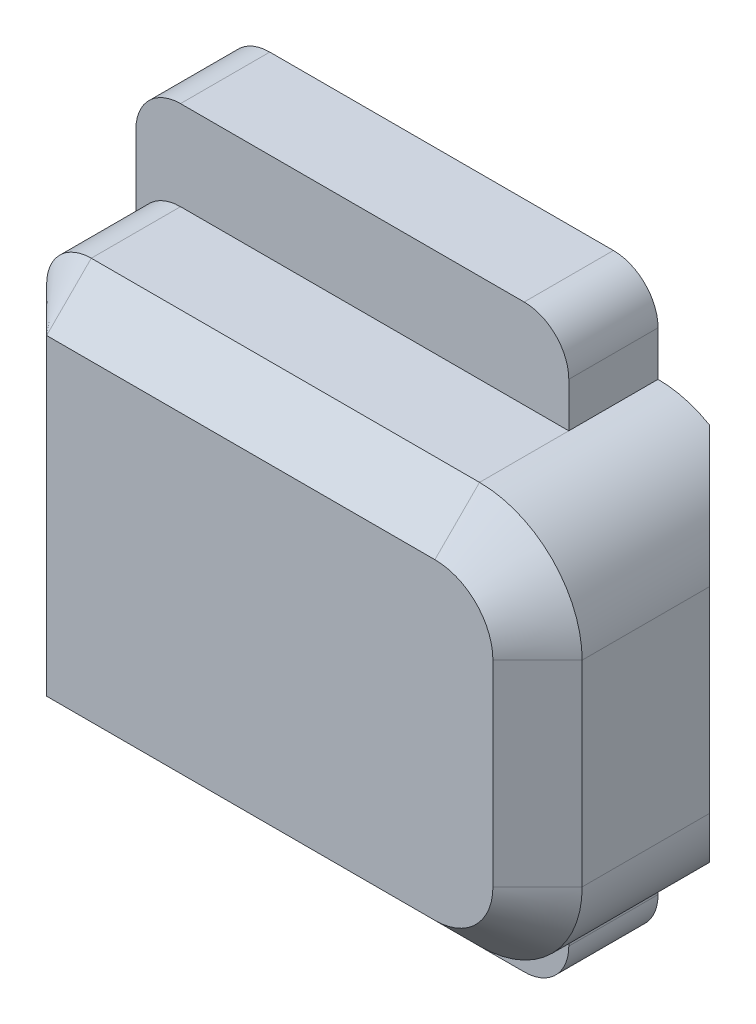
ISO-10303-21;
HEADER;
FILE_DESCRIPTION(('STEP AP214'),'2;1');
FILE_NAME('part.step','',(''),(''),'','','');
FILE_SCHEMA(('AUTOMOTIVE_DESIGN { 1 0 10303 214 1 1 1 1 }'));
ENDSEC;
DATA;
#1=APPLICATION_CONTEXT('core data for automotive mechanical design processes');
#2=APPLICATION_PROTOCOL_DEFINITION('international standard','automotive_design',2000,#1);
#3=PRODUCT_CONTEXT('',#1,'mechanical');
#4=PRODUCT('Part','Part','',(#3));
#5=PRODUCT_RELATED_PRODUCT_CATEGORY('part','',(#4));
#6=PRODUCT_DEFINITION_FORMATION('','',#4);
#7=PRODUCT_DEFINITION_CONTEXT('part definition',#1,'design');
#8=PRODUCT_DEFINITION('design','',#6,#7);
#9=PRODUCT_DEFINITION_SHAPE('','',#8);
#10=(LENGTH_UNIT() NAMED_UNIT(*) SI_UNIT(.MILLI.,.METRE.));
#11=(NAMED_UNIT(*) PLANE_ANGLE_UNIT() SI_UNIT($,.RADIAN.));
#12=(NAMED_UNIT(*) SI_UNIT($,.STERADIAN.) SOLID_ANGLE_UNIT());
#13=UNCERTAINTY_MEASURE_WITH_UNIT(LENGTH_MEASURE(1.E-05),#10,'distance_accuracy_value','');
#14=(GEOMETRIC_REPRESENTATION_CONTEXT(3) GLOBAL_UNCERTAINTY_ASSIGNED_CONTEXT((#13)) GLOBAL_UNIT_ASSIGNED_CONTEXT((#10,
#11,#12)) REPRESENTATION_CONTEXT('',''));
#15=CARTESIAN_POINT('',(0.,0.,0.));
#16=DIRECTION('',(0.,0.,1.));
#17=DIRECTION('',(1.,0.,0.));
#18=AXIS2_PLACEMENT_3D('',#15,#16,#17);
#19=CARTESIAN_POINT('',(7.9,-0.100000000000001,-2.5));
#20=DIRECTION('',(0.,1.,0.));
#21=DIRECTION('',(-1.,0.,0.));
#22=AXIS2_PLACEMENT_3D('',#19,#20,#21);
#23=PLANE('',#22);
#24=DIRECTION('',(0.,0.,-1.));
#25=VECTOR('',#24,1.);
#26=CARTESIAN_POINT('',(3.55,-0.100000000000001,0.));
#27=LINE('',#26,#25);
#28=CARTESIAN_POINT('',(3.55,-0.100000000000001,-1.5));
#29=VERTEX_POINT('',#28);
#30=CARTESIAN_POINT('',(3.55,-0.100000000000001,-0.500000000000003));
#31=VERTEX_POINT('',#30);
#32=EDGE_CURVE('E253',#29,#31,#27,.F.);
#33=ORIENTED_EDGE('',*,*,#32,.T.);
#34=DIRECTION('',(1.,0.,0.));
#35=VECTOR('',#34,1.);
#36=CARTESIAN_POINT('',(7.9,-0.100000000000001,-0.500000000000003));
#37=LINE('',#36,#35);
#38=CARTESIAN_POINT('',(7.9,-0.100000000000002,-0.500000000000003));
#39=VERTEX_POINT('',#38);
#40=EDGE_CURVE('E45',#31,#39,#37,.T.);
#41=ORIENTED_EDGE('',*,*,#40,.T.);
#42=DIRECTION('',(0.,0.,1.));
#43=VECTOR('',#42,1.);
#44=CARTESIAN_POINT('',(7.9,-0.100000000000002,-2.5));
#45=LINE('',#44,#43);
#46=CARTESIAN_POINT('',(7.9,-0.100000000000002,-1.5));
#47=VERTEX_POINT('',#46);
#48=EDGE_CURVE('E219',#47,#39,#45,.T.);
#49=ORIENTED_EDGE('',*,*,#48,.F.);
#50=DIRECTION('',(-1.,0.,0.));
#51=VECTOR('',#50,1.);
#52=CARTESIAN_POINT('',(7.9,-0.100000000000001,-1.5));
#53=LINE('',#52,#51);
#54=EDGE_CURVE('E212',#47,#29,#53,.T.);
#55=ORIENTED_EDGE('',*,*,#54,.T.);
#56=EDGE_LOOP('',(#33,#41,#49,#55));
#57=FACE_BOUND('',#56,.T.);
#58=ADVANCED_FACE('F36',(#57),#23,.T.);
#59=CARTESIAN_POINT('',(-7.9,-4.6,-2.5));
#60=DIRECTION('',(0.,-1.,0.));
#61=DIRECTION('',(0.,0.,-1.));
#62=AXIS2_PLACEMENT_3D('',#59,#60,#61);
#63=PLANE('',#62);
#64=DIRECTION('',(0.,0.,1.));
#65=VECTOR('',#64,1.);
#66=CARTESIAN_POINT('',(7.89999999999999,-4.6,-2.5));
#67=LINE('',#66,#65);
#68=CARTESIAN_POINT('',(7.9,-4.6,-1.5));
#69=VERTEX_POINT('',#68);
#70=CARTESIAN_POINT('',(7.89999999999999,-4.6,-0.500000000000003));
#71=VERTEX_POINT('',#70);
#72=EDGE_CURVE('E206',#69,#71,#67,.T.);
#73=ORIENTED_EDGE('',*,*,#72,.T.);
#74=DIRECTION('',(-1.,0.,0.));
#75=VECTOR('',#74,1.);
#76=CARTESIAN_POINT('',(-7.9,-4.6,-0.500000000000003));
#77=LINE('',#76,#75);
#78=CARTESIAN_POINT('',(3.55,-4.6,-0.500000000000003));
#79=VERTEX_POINT('',#78);
#80=EDGE_CURVE('E289',#71,#79,#77,.T.);
#81=ORIENTED_EDGE('',*,*,#80,.T.);
#82=DIRECTION('',(0.,0.,1.));
#83=VECTOR('',#82,1.);
#84=CARTESIAN_POINT('',(3.55,-4.6,-1.5));
#85=LINE('',#84,#83);
#86=CARTESIAN_POINT('',(3.55,-4.6,-1.5));
#87=VERTEX_POINT('',#86);
#88=EDGE_CURVE('E251',#79,#87,#85,.F.);
#89=ORIENTED_EDGE('',*,*,#88,.T.);
#90=DIRECTION('',(1.,0.,0.));
#91=VECTOR('',#90,1.);
#92=CARTESIAN_POINT('',(-7.9,-4.6,-1.5));
#93=LINE('',#92,#91);
#94=EDGE_CURVE('E349',#87,#69,#93,.T.);
#95=ORIENTED_EDGE('',*,*,#94,.T.);
#96=EDGE_LOOP('',(#73,#81,#89,#95));
#97=FACE_BOUND('',#96,.T.);
#98=ADVANCED_FACE('F395',(#97),#63,.T.);
#99=CARTESIAN_POINT('',(7.9,-1.25,-2.5));
#100=DIRECTION('',(0.,0.,1.));
#101=DIRECTION('',(1.,0.,0.));
#102=AXIS2_PLACEMENT_3D('',#99,#100,#101);
#103=CYLINDRICAL_SURFACE('',#102,1.15);
#104=ORIENTED_EDGE('',*,*,#48,.T.);
#105=CARTESIAN_POINT('',(7.9,-1.25,-0.500000000000003));
#106=DIRECTION('',(0.,0.,1.));
#107=DIRECTION('',(1.,0.,0.));
#108=AXIS2_PLACEMENT_3D('',#105,#106,#107);
#109=CIRCLE('',#108,1.15);
#110=CARTESIAN_POINT('',(9.05,-1.25,-0.500000000000003));
#111=VERTEX_POINT('',#110);
#112=EDGE_CURVE('E11',#39,#111,#109,.F.);
#113=ORIENTED_EDGE('',*,*,#112,.T.);
#114=DIRECTION('',(0.,0.,1.));
#115=VECTOR('',#114,1.);
#116=CARTESIAN_POINT('',(9.05,-1.25,-2.5));
#117=LINE('',#116,#115);
#118=CARTESIAN_POINT('',(9.05,-1.25,-1.92500000000001));
#119=VERTEX_POINT('',#118);
#120=EDGE_CURVE('E198',#119,#111,#117,.T.);
#121=ORIENTED_EDGE('',*,*,#120,.F.);
#122=CARTESIAN_POINT('',(7.9,-1.25,-3.07499999999999));
#123=DIRECTION('',(-0.707106781186543,0.,0.707106781186552));
#124=DIRECTION('',(0.707106781186552,0.,0.707106781186543));
#125=AXIS2_PLACEMENT_3D('',#122,#123,#124);
#126=ELLIPSE('',#125,1.62634559672905,1.15);
#127=CARTESIAN_POINT('',(8.475,-0.254070785647898,-2.5));
#128=VERTEX_POINT('',#127);
#129=EDGE_CURVE('E183',#128,#119,#126,.F.);
#130=ORIENTED_EDGE('',*,*,#129,.F.);
#131=CARTESIAN_POINT('',(7.9,-1.25,-2.5));
#132=DIRECTION('',(0.,0.,1.));
#133=DIRECTION('',(1.,0.,0.));
#134=AXIS2_PLACEMENT_3D('',#131,#132,#133);
#135=CIRCLE('',#134,1.15);
#136=CARTESIAN_POINT('',(7.9,-0.0999999999999977,-2.5));
#137=VERTEX_POINT('',#136);
#138=EDGE_CURVE('E196',#128,#137,#135,.T.);
#139=ORIENTED_EDGE('',*,*,#138,.T.);
#140=EDGE_CURVE('E216',#137,#47,#45,.T.);
#141=ORIENTED_EDGE('',*,*,#140,.T.);
#142=EDGE_LOOP('',(#104,#113,#121,#130,#139,#141));
#143=FACE_BOUND('',#142,.T.);
#144=ADVANCED_FACE('F194',(#143),#103,.T.);
#145=CARTESIAN_POINT('',(9.05,-3.45,-2.5));
#146=DIRECTION('',(1.,0.,0.));
#147=DIRECTION('',(0.,0.,-1.));
#148=AXIS2_PLACEMENT_3D('',#145,#146,#147);
#149=PLANE('',#148);
#150=ORIENTED_EDGE('',*,*,#120,.T.);
#151=DIRECTION('',(0.,-1.,0.));
#152=VECTOR('',#151,1.);
#153=CARTESIAN_POINT('',(9.05,-3.45,-0.500000000000003));
#154=LINE('',#153,#152);
#155=CARTESIAN_POINT('',(9.05,-3.45,-0.500000000000003));
#156=VERTEX_POINT('',#155);
#157=EDGE_CURVE('E297',#111,#156,#154,.T.);
#158=ORIENTED_EDGE('',*,*,#157,.T.);
#159=DIRECTION('',(0.,0.,1.));
#160=VECTOR('',#159,1.);
#161=CARTESIAN_POINT('',(9.05,-3.45,-2.5));
#162=LINE('',#161,#160);
#163=CARTESIAN_POINT('',(9.05,-3.45,-1.92500000000001));
#164=VERTEX_POINT('',#163);
#165=EDGE_CURVE('E221',#164,#156,#162,.T.);
#166=ORIENTED_EDGE('',*,*,#165,.F.);
#167=DIRECTION('',(0.,1.,0.));
#168=VECTOR('',#167,1.);
#169=CARTESIAN_POINT('',(9.05,-5.6,-1.92500000000001));
#170=LINE('',#169,#168);
#171=EDGE_CURVE('E337',#164,#119,#170,.T.);
#172=ORIENTED_EDGE('',*,*,#171,.T.);
#173=EDGE_LOOP('',(#150,#158,#166,#172));
#174=FACE_BOUND('',#173,.T.);
#175=ADVANCED_FACE('F414',(#174),#149,.T.);
#176=CARTESIAN_POINT('',(7.9,-3.45,-2.5));
#177=DIRECTION('',(0.,0.,1.));
#178=DIRECTION('',(1.,0.,0.));
#179=AXIS2_PLACEMENT_3D('',#176,#177,#178);
#180=CYLINDRICAL_SURFACE('',#179,1.15);
#181=ORIENTED_EDGE('',*,*,#165,.T.);
#182=CARTESIAN_POINT('',(7.9,-3.45,-0.500000000000003));
#183=DIRECTION('',(0.,0.,1.));
#184=DIRECTION('',(1.,0.,0.));
#185=AXIS2_PLACEMENT_3D('',#182,#183,#184);
#186=CIRCLE('',#185,1.15);
#187=EDGE_CURVE('E293',#156,#71,#186,.F.);
#188=ORIENTED_EDGE('',*,*,#187,.T.);
#189=ORIENTED_EDGE('',*,*,#72,.F.);
#190=CARTESIAN_POINT('',(7.9,-4.6,-2.5));
#191=VERTEX_POINT('',#190);
#192=EDGE_CURVE('E210',#191,#69,#67,.T.);
#193=ORIENTED_EDGE('',*,*,#192,.F.);
#194=CARTESIAN_POINT('',(7.9,-3.45,-2.5));
#195=DIRECTION('',(0.,0.,1.));
#196=DIRECTION('',(-1.,0.,0.));
#197=AXIS2_PLACEMENT_3D('',#194,#195,#196);
#198=CIRCLE('',#197,1.15);
#199=CARTESIAN_POINT('',(8.475,-4.44592921435211,-2.5));
#200=VERTEX_POINT('',#199);
#201=EDGE_CURVE('E207',#191,#200,#198,.T.);
#202=ORIENTED_EDGE('',*,*,#201,.T.);
#203=CARTESIAN_POINT('',(7.9,-3.45,-3.07499999999999));
#204=DIRECTION('',(-0.707106781186543,0.,0.707106781186552));
#205=DIRECTION('',(0.707106781186552,0.,0.707106781186543));
#206=AXIS2_PLACEMENT_3D('',#203,#204,#205);
#207=ELLIPSE('',#206,1.62634559672905,1.15);
#208=EDGE_CURVE('E186',#164,#200,#207,.F.);
#209=ORIENTED_EDGE('',*,*,#208,.F.);
#210=EDGE_LOOP('',(#181,#188,#189,#193,#202,#209));
#211=FACE_BOUND('',#210,.T.);
#212=ADVANCED_FACE('F391',(#211),#180,.T.);
#213=CARTESIAN_POINT('',(-7.9,-1.25,-2.5));
#214=DIRECTION('',(0.,0.,1.));
#215=DIRECTION('',(1.,0.,0.));
#216=AXIS2_PLACEMENT_3D('',#213,#214,#215);
#217=PLANE('',#216);
#218=DIRECTION('',(0.,-1.,0.));
#219=VECTOR('',#218,1.);
#220=CARTESIAN_POINT('',(3.05,0.899999999999999,-2.5));
#221=LINE('',#220,#219);
#222=CARTESIAN_POINT('',(3.05,0.399999999999998,-2.5));
#223=VERTEX_POINT('',#222);
#224=CARTESIAN_POINT('',(3.05,-5.1,-2.5));
#225=VERTEX_POINT('',#224);
#226=EDGE_CURVE('E322',#223,#225,#221,.T.);
#227=ORIENTED_EDGE('',*,*,#226,.F.);
#228=CARTESIAN_POINT('',(3.55,0.399999999999998,-2.5));
#229=DIRECTION('',(0.,0.,1.));
#230=DIRECTION('',(1.,0.,0.));
#231=AXIS2_PLACEMENT_3D('',#228,#229,#230);
#232=CIRCLE('',#231,0.5);
#233=CARTESIAN_POINT('',(3.55,0.899999999999998,-2.5));
#234=VERTEX_POINT('',#233);
#235=EDGE_CURVE('E257',#223,#234,#232,.F.);
#236=ORIENTED_EDGE('',*,*,#235,.T.);
#237=DIRECTION('',(1.,0.,0.));
#238=VECTOR('',#237,1.);
#239=CARTESIAN_POINT('',(7.9,0.899999999999998,-2.5));
#240=LINE('',#239,#238);
#241=CARTESIAN_POINT('',(7.4,0.899999999999998,-2.5));
#242=VERTEX_POINT('',#241);
#243=EDGE_CURVE('E199',#234,#242,#240,.T.);
#244=ORIENTED_EDGE('',*,*,#243,.T.);
#245=CARTESIAN_POINT('',(7.4,0.399999999999998,-2.5));
#246=DIRECTION('',(0.,0.,1.));
#247=DIRECTION('',(1.,0.,0.));
#248=AXIS2_PLACEMENT_3D('',#245,#246,#247);
#249=CIRCLE('',#248,0.5);
#250=CARTESIAN_POINT('',(7.9,0.399999999999998,-2.5));
#251=VERTEX_POINT('',#250);
#252=EDGE_CURVE('E226',#242,#251,#249,.F.);
#253=ORIENTED_EDGE('',*,*,#252,.T.);
#254=DIRECTION('',(0.,-1.,0.));
#255=VECTOR('',#254,1.);
#256=CARTESIAN_POINT('',(7.9,0.899999999999998,-2.5));
#257=LINE('',#256,#255);
#258=EDGE_CURVE('E204',#251,#137,#257,.T.);
#259=ORIENTED_EDGE('',*,*,#258,.T.);
#260=ORIENTED_EDGE('',*,*,#138,.F.);
#261=DIRECTION('',(0.,-1.,0.));
#262=VECTOR('',#261,1.);
#263=CARTESIAN_POINT('',(8.475,-1.25,-2.5));
#264=LINE('',#263,#262);
#265=EDGE_CURVE('E180',#128,#200,#264,.T.);
#266=ORIENTED_EDGE('',*,*,#265,.T.);
#267=ORIENTED_EDGE('',*,*,#201,.F.);
#268=CARTESIAN_POINT('',(7.9,-5.1,-2.5));
#269=VERTEX_POINT('',#268);
#270=EDGE_CURVE('E351',#191,#269,#257,.T.);
#271=ORIENTED_EDGE('',*,*,#270,.T.);
#272=CARTESIAN_POINT('',(7.4,-5.1,-2.5));
#273=DIRECTION('',(0.,0.,1.));
#274=DIRECTION('',(1.,0.,0.));
#275=AXIS2_PLACEMENT_3D('',#272,#273,#274);
#276=CIRCLE('',#275,0.5);
#277=CARTESIAN_POINT('',(7.4,-5.6,-2.5));
#278=VERTEX_POINT('',#277);
#279=EDGE_CURVE('E218',#269,#278,#276,.F.);
#280=ORIENTED_EDGE('',*,*,#279,.T.);
#281=DIRECTION('',(-1.,0.,0.));
#282=VECTOR('',#281,1.);
#283=CARTESIAN_POINT('',(7.9,-5.6,-2.5));
#284=LINE('',#283,#282);
#285=CARTESIAN_POINT('',(3.55,-5.6,-2.5));
#286=VERTEX_POINT('',#285);
#287=EDGE_CURVE('E343',#278,#286,#284,.T.);
#288=ORIENTED_EDGE('',*,*,#287,.T.);
#289=CARTESIAN_POINT('',(3.55,-5.1,-2.5));
#290=DIRECTION('',(0.,0.,1.));
#291=DIRECTION('',(1.,0.,0.));
#292=AXIS2_PLACEMENT_3D('',#289,#290,#291);
#293=CIRCLE('',#292,0.5);
#294=EDGE_CURVE('E255',#286,#225,#293,.F.);
#295=ORIENTED_EDGE('',*,*,#294,.T.);
#296=EDGE_LOOP('',(#227,#236,#244,#253,#259,#260,#266,#267,#271,#280,#288,#295));
#297=FACE_BOUND('',#296,.T.);
#298=ADVANCED_FACE('F202',(#297),#217,.F.);
#299=CARTESIAN_POINT('',(-7.9,-1.25,0.));
#300=DIRECTION('',(0.,0.,1.));
#301=DIRECTION('',(1.,0.,0.));
#302=AXIS2_PLACEMENT_3D('',#299,#300,#301);
#303=PLANE('',#302);
#304=DIRECTION('',(0.,-1.,0.));
#305=VECTOR('',#304,1.);
#306=CARTESIAN_POINT('',(3.55,-4.1,0.));
#307=LINE('',#306,#305);
#308=CARTESIAN_POINT('',(3.55,-0.600000000000002,0.));
#309=VERTEX_POINT('',#308);
#310=CARTESIAN_POINT('',(3.55,-4.1,0.));
#311=VERTEX_POINT('',#310);
#312=EDGE_CURVE('E284',#309,#311,#307,.T.);
#313=ORIENTED_EDGE('',*,*,#312,.T.);
#314=DIRECTION('',(1.,0.,0.));
#315=VECTOR('',#314,1.);
#316=CARTESIAN_POINT('',(-7.9,-4.1,0.));
#317=LINE('',#316,#315);
#318=CARTESIAN_POINT('',(7.89999999999999,-4.1,0.));
#319=VERTEX_POINT('',#318);
#320=EDGE_CURVE('E286',#311,#319,#317,.T.);
#321=ORIENTED_EDGE('',*,*,#320,.T.);
#322=CARTESIAN_POINT('',(7.9,-3.45,0.));
#323=DIRECTION('',(0.,0.,1.));
#324=DIRECTION('',(1.,0.,0.));
#325=AXIS2_PLACEMENT_3D('',#322,#323,#324);
#326=CIRCLE('',#325,0.649999999999998);
#327=CARTESIAN_POINT('',(8.55,-3.45,0.));
#328=VERTEX_POINT('',#327);
#329=EDGE_CURVE('E282',#319,#328,#326,.T.);
#330=ORIENTED_EDGE('',*,*,#329,.T.);
#331=DIRECTION('',(0.,1.,0.));
#332=VECTOR('',#331,1.);
#333=CARTESIAN_POINT('',(8.55,-1.25,0.));
#334=LINE('',#333,#332);
#335=CARTESIAN_POINT('',(8.55,-1.25,0.));
#336=VERTEX_POINT('',#335);
#337=EDGE_CURVE('E280',#328,#336,#334,.T.);
#338=ORIENTED_EDGE('',*,*,#337,.T.);
#339=CARTESIAN_POINT('',(7.9,-1.25,0.));
#340=DIRECTION('',(0.,0.,1.));
#341=DIRECTION('',(1.,0.,0.));
#342=AXIS2_PLACEMENT_3D('',#339,#340,#341);
#343=CIRCLE('',#342,0.649999999999998);
#344=CARTESIAN_POINT('',(7.9,-0.600000000000003,0.));
#345=VERTEX_POINT('',#344);
#346=EDGE_CURVE('E276',#336,#345,#343,.T.);
#347=ORIENTED_EDGE('',*,*,#346,.T.);
#348=DIRECTION('',(-1.,0.,0.));
#349=VECTOR('',#348,1.);
#350=CARTESIAN_POINT('',(-7.9,-0.600000000000002,0.));
#351=LINE('',#350,#349);
#352=EDGE_CURVE('E278',#345,#309,#351,.T.);
#353=ORIENTED_EDGE('',*,*,#352,.T.);
#354=EDGE_LOOP('',(#313,#321,#330,#338,#347,#353));
#355=FACE_BOUND('',#354,.T.);
#356=ADVANCED_FACE('F376',(#355),#303,.T.);
#357=CARTESIAN_POINT('',(7.9,-5.6,-1.5));
#358=DIRECTION('',(0.,-1.,0.));
#359=DIRECTION('',(0.,0.,-1.));
#360=AXIS2_PLACEMENT_3D('',#357,#358,#359);
#361=PLANE('',#360);
#362=DIRECTION('',(-1.,0.,0.));
#363=VECTOR('',#362,1.);
#364=CARTESIAN_POINT('',(7.9,-5.6,-1.5));
#365=LINE('',#364,#363);
#366=CARTESIAN_POINT('',(7.4,-5.6,-1.5));
#367=VERTEX_POINT('',#366);
#368=CARTESIAN_POINT('',(3.55,-5.6,-1.5));
#369=VERTEX_POINT('',#368);
#370=EDGE_CURVE('E346',#367,#369,#365,.T.);
#371=ORIENTED_EDGE('',*,*,#370,.T.);
#372=DIRECTION('',(0.,0.,-1.));
#373=VECTOR('',#372,1.);
#374=CARTESIAN_POINT('',(3.55,-5.6,-2.5));
#375=LINE('',#374,#373);
#376=EDGE_CURVE('E263',#369,#286,#375,.T.);
#377=ORIENTED_EDGE('',*,*,#376,.T.);
#378=ORIENTED_EDGE('',*,*,#287,.F.);
#379=DIRECTION('',(0.,0.,-1.));
#380=VECTOR('',#379,1.);
#381=CARTESIAN_POINT('',(7.4,-5.6,-1.5));
#382=LINE('',#381,#380);
#383=EDGE_CURVE('E236',#278,#367,#382,.F.);
#384=ORIENTED_EDGE('',*,*,#383,.T.);
#385=EDGE_LOOP('',(#371,#377,#378,#384));
#386=FACE_BOUND('',#385,.T.);
#387=ADVANCED_FACE('F599',(#386),#361,.T.);
#388=CARTESIAN_POINT('',(0.,0.,-1.5));
#389=DIRECTION('',(0.,0.,-1.));
#390=DIRECTION('',(-1.,0.,0.));
#391=AXIS2_PLACEMENT_3D('',#388,#389,#390);
#392=PLANE('',#391);
#393=DIRECTION('',(0.,-1.,0.));
#394=VECTOR('',#393,1.);
#395=CARTESIAN_POINT('',(3.05,0.,-1.5));
#396=LINE('',#395,#394);
#397=CARTESIAN_POINT('',(3.05,-4.1,-1.5));
#398=VERTEX_POINT('',#397);
#399=CARTESIAN_POINT('',(3.05,-5.1,-1.5));
#400=VERTEX_POINT('',#399);
#401=EDGE_CURVE('E332',#398,#400,#396,.T.);
#402=ORIENTED_EDGE('',*,*,#401,.T.);
#403=CARTESIAN_POINT('',(3.55,-5.1,-1.5));
#404=DIRECTION('',(0.,0.,-1.));
#405=DIRECTION('',(-1.,0.,0.));
#406=AXIS2_PLACEMENT_3D('',#403,#404,#405);
#407=CIRCLE('',#406,0.5);
#408=EDGE_CURVE('E266',#400,#369,#407,.F.);
#409=ORIENTED_EDGE('',*,*,#408,.T.);
#410=ORIENTED_EDGE('',*,*,#370,.F.);
#411=CARTESIAN_POINT('',(7.4,-5.1,-1.5));
#412=DIRECTION('',(0.,0.,-1.));
#413=DIRECTION('',(-1.,0.,0.));
#414=AXIS2_PLACEMENT_3D('',#411,#412,#413);
#415=CIRCLE('',#414,0.5);
#416=CARTESIAN_POINT('',(7.9,-5.1,-1.5));
#417=VERTEX_POINT('',#416);
#418=EDGE_CURVE('E238',#367,#417,#415,.F.);
#419=ORIENTED_EDGE('',*,*,#418,.T.);
#420=DIRECTION('',(0.,-1.,0.));
#421=VECTOR('',#420,1.);
#422=CARTESIAN_POINT('',(7.9,0.899999999999998,-1.5));
#423=LINE('',#422,#421);
#424=EDGE_CURVE('E342',#69,#417,#423,.T.);
#425=ORIENTED_EDGE('',*,*,#424,.F.);
#426=ORIENTED_EDGE('',*,*,#94,.F.);
#427=CARTESIAN_POINT('',(3.55,-4.1,-1.5));
#428=DIRECTION('',(0.,0.,-1.));
#429=DIRECTION('',(-1.,0.,0.));
#430=AXIS2_PLACEMENT_3D('',#427,#428,#429);
#431=CIRCLE('',#430,0.5);
#432=EDGE_CURVE('E268',#87,#398,#431,.T.);
#433=ORIENTED_EDGE('',*,*,#432,.T.);
#434=EDGE_LOOP('',(#402,#409,#410,#419,#425,#426,#433));
#435=FACE_BOUND('',#434,.T.);
#436=ADVANCED_FACE('F406',(#435),#392,.F.);
#437=CARTESIAN_POINT('',(7.9,0.899999999999998,-1.5));
#438=DIRECTION('',(1.,0.,0.));
#439=DIRECTION('',(0.,0.,-1.));
#440=AXIS2_PLACEMENT_3D('',#437,#438,#439);
#441=PLANE('',#440);
#442=ORIENTED_EDGE('',*,*,#424,.T.);
#443=DIRECTION('',(0.,0.,-1.));
#444=VECTOR('',#443,1.);
#445=CARTESIAN_POINT('',(7.9,-5.1,-1.5));
#446=LINE('',#445,#444);
#447=EDGE_CURVE('E192',#417,#269,#446,.T.);
#448=ORIENTED_EDGE('',*,*,#447,.T.);
#449=ORIENTED_EDGE('',*,*,#270,.F.);
#450=ORIENTED_EDGE('',*,*,#192,.T.);
#451=EDGE_LOOP('',(#442,#448,#449,#450));
#452=FACE_BOUND('',#451,.T.);
#453=ADVANCED_FACE('F403',(#452),#441,.T.);
#454=DIRECTION('',(1.,0.,0.));
#455=VECTOR('',#454,1.);
#456=CARTESIAN_POINT('',(7.9,0.899999999999998,-1.5));
#457=LINE('',#456,#455);
#458=CARTESIAN_POINT('',(3.55,0.899999999999998,-1.5));
#459=VERTEX_POINT('',#458);
#460=CARTESIAN_POINT('',(7.4,0.899999999999998,-1.5));
#461=VERTEX_POINT('',#460);
#462=EDGE_CURVE('E340',#459,#461,#457,.T.);
#463=ORIENTED_EDGE('',*,*,#462,.F.);
#464=CARTESIAN_POINT('',(3.55,0.399999999999998,-1.5));
#465=DIRECTION('',(0.,0.,-1.));
#466=DIRECTION('',(-1.,0.,0.));
#467=AXIS2_PLACEMENT_3D('',#464,#465,#466);
#468=CIRCLE('',#467,0.5);
#469=CARTESIAN_POINT('',(3.05,0.399999999999998,-1.5));
#470=VERTEX_POINT('',#469);
#471=EDGE_CURVE('E261',#459,#470,#468,.F.);
#472=ORIENTED_EDGE('',*,*,#471,.T.);
#473=DIRECTION('',(0.,-1.,0.));
#474=VECTOR('',#473,1.);
#475=CARTESIAN_POINT('',(3.05,0.,-1.5));
#476=LINE('',#475,#474);
#477=CARTESIAN_POINT('',(3.05,-0.600000000000001,-1.5));
#478=VERTEX_POINT('',#477);
#479=EDGE_CURVE('E327',#470,#478,#476,.T.);
#480=ORIENTED_EDGE('',*,*,#479,.T.);
#481=CARTESIAN_POINT('',(3.55,-0.600000000000001,-1.5));
#482=DIRECTION('',(0.,0.,-1.));
#483=DIRECTION('',(-1.,0.,0.));
#484=AXIS2_PLACEMENT_3D('',#481,#482,#483);
#485=CIRCLE('',#484,0.5);
#486=EDGE_CURVE('E271',#478,#29,#485,.T.);
#487=ORIENTED_EDGE('',*,*,#486,.T.);
#488=ORIENTED_EDGE('',*,*,#54,.F.);
#489=CARTESIAN_POINT('',(7.9,0.399999999999998,-1.5));
#490=VERTEX_POINT('',#489);
#491=EDGE_CURVE('E344',#490,#47,#423,.T.);
#492=ORIENTED_EDGE('',*,*,#491,.F.);
#493=CARTESIAN_POINT('',(7.4,0.399999999999998,-1.5));
#494=DIRECTION('',(0.,0.,-1.));
#495=DIRECTION('',(-1.,0.,0.));
#496=AXIS2_PLACEMENT_3D('',#493,#494,#495);
#497=CIRCLE('',#496,0.5);
#498=EDGE_CURVE('E231',#490,#461,#497,.F.);
#499=ORIENTED_EDGE('',*,*,#498,.T.);
#500=EDGE_LOOP('',(#463,#472,#480,#487,#488,#492,#499));
#501=FACE_BOUND('',#500,.T.);
#502=ADVANCED_FACE('F578',(#501),#392,.F.);
#503=ORIENTED_EDGE('',*,*,#258,.F.);
#504=DIRECTION('',(0.,0.,-1.));
#505=VECTOR('',#504,1.);
#506=CARTESIAN_POINT('',(7.9,0.399999999999998,-1.5));
#507=LINE('',#506,#505);
#508=EDGE_CURVE('E234',#251,#490,#507,.F.);
#509=ORIENTED_EDGE('',*,*,#508,.T.);
#510=ORIENTED_EDGE('',*,*,#491,.T.);
#511=ORIENTED_EDGE('',*,*,#140,.F.);
#512=EDGE_LOOP('',(#503,#509,#510,#511));
#513=FACE_BOUND('',#512,.T.);
#514=ADVANCED_FACE('F569',(#513),#441,.T.);
#515=CARTESIAN_POINT('',(7.9,0.899999999999998,-1.5));
#516=DIRECTION('',(0.,1.,0.));
#517=DIRECTION('',(0.,0.,1.));
#518=AXIS2_PLACEMENT_3D('',#515,#516,#517);
#519=PLANE('',#518);
#520=ORIENTED_EDGE('',*,*,#243,.F.);
#521=DIRECTION('',(0.,0.,-1.));
#522=VECTOR('',#521,1.);
#523=CARTESIAN_POINT('',(3.55,0.899999999999998,-1.5));
#524=LINE('',#523,#522);
#525=EDGE_CURVE('E259',#234,#459,#524,.F.);
#526=ORIENTED_EDGE('',*,*,#525,.T.);
#527=ORIENTED_EDGE('',*,*,#462,.T.);
#528=DIRECTION('',(0.,0.,-1.));
#529=VECTOR('',#528,1.);
#530=CARTESIAN_POINT('',(7.4,0.899999999999998,-1.5));
#531=LINE('',#530,#529);
#532=EDGE_CURVE('E228',#461,#242,#531,.T.);
#533=ORIENTED_EDGE('',*,*,#532,.T.);
#534=EDGE_LOOP('',(#520,#526,#527,#533));
#535=FACE_BOUND('',#534,.T.);
#536=ADVANCED_FACE('F442',(#535),#519,.T.);
#537=CARTESIAN_POINT('',(7.4,0.399999999999998,-1.5));
#538=DIRECTION('',(0.,0.,-1.));
#539=DIRECTION('',(-1.,0.,0.));
#540=AXIS2_PLACEMENT_3D('',#537,#538,#539);
#541=CYLINDRICAL_SURFACE('',#540,0.5);
#542=ORIENTED_EDGE('',*,*,#498,.F.);
#543=ORIENTED_EDGE('',*,*,#508,.F.);
#544=ORIENTED_EDGE('',*,*,#252,.F.);
#545=ORIENTED_EDGE('',*,*,#532,.F.);
#546=EDGE_LOOP('',(#542,#543,#544,#545));
#547=FACE_BOUND('',#546,.T.);
#548=ADVANCED_FACE('F439',(#547),#541,.T.);
#549=CARTESIAN_POINT('',(7.4,-5.1,-1.5));
#550=DIRECTION('',(0.,0.,-1.));
#551=DIRECTION('',(-1.,0.,0.));
#552=AXIS2_PLACEMENT_3D('',#549,#550,#551);
#553=CYLINDRICAL_SURFACE('',#552,0.5);
#554=ORIENTED_EDGE('',*,*,#418,.F.);
#555=ORIENTED_EDGE('',*,*,#383,.F.);
#556=ORIENTED_EDGE('',*,*,#279,.F.);
#557=ORIENTED_EDGE('',*,*,#447,.F.);
#558=EDGE_LOOP('',(#554,#555,#556,#557));
#559=FACE_BOUND('',#558,.T.);
#560=ADVANCED_FACE('F411',(#559),#553,.T.);
#561=CARTESIAN_POINT('',(8.475,-5.6,-2.5));
#562=DIRECTION('',(-0.707106781186543,0.,0.707106781186552));
#563=DIRECTION('',(0.707106781186552,0.,0.707106781186543));
#564=AXIS2_PLACEMENT_3D('',#561,#562,#563);
#565=PLANE('',#564);
#566=ORIENTED_EDGE('',*,*,#129,.T.);
#567=ORIENTED_EDGE('',*,*,#171,.F.);
#568=ORIENTED_EDGE('',*,*,#208,.T.);
#569=ORIENTED_EDGE('',*,*,#265,.F.);
#570=EDGE_LOOP('',(#566,#567,#568,#569));
#571=FACE_BOUND('',#570,.T.);
#572=ADVANCED_FACE('F182',(#571),#565,.F.);
#573=CARTESIAN_POINT('',(3.05,0.899999999999999,0.));
#574=DIRECTION('',(1.,0.,0.));
#575=DIRECTION('',(0.,1.,0.));
#576=AXIS2_PLACEMENT_3D('',#573,#574,#575);
#577=PLANE('',#576);
#578=DIRECTION('',(0.,0.,1.));
#579=VECTOR('',#578,1.);
#580=CARTESIAN_POINT('',(3.05,-4.1,0.));
#581=LINE('',#580,#579);
#582=CARTESIAN_POINT('',(3.05,-4.1,-0.500000000000003));
#583=VERTEX_POINT('',#582);
#584=EDGE_CURVE('E248',#398,#583,#581,.T.);
#585=ORIENTED_EDGE('',*,*,#584,.T.);
#586=DIRECTION('',(0.,1.,0.));
#587=VECTOR('',#586,1.);
#588=CARTESIAN_POINT('',(3.05,-0.600000000000001,-0.500000000000003));
#589=LINE('',#588,#587);
#590=CARTESIAN_POINT('',(3.05,-0.600000000000001,-0.500000000000003));
#591=VERTEX_POINT('',#590);
#592=EDGE_CURVE('E291',#583,#591,#589,.T.);
#593=ORIENTED_EDGE('',*,*,#592,.T.);
#594=DIRECTION('',(0.,0.,-1.));
#595=VECTOR('',#594,1.);
#596=CARTESIAN_POINT('',(3.05,-0.600000000000001,-1.5));
#597=LINE('',#596,#595);
#598=EDGE_CURVE('E246',#591,#478,#597,.T.);
#599=ORIENTED_EDGE('',*,*,#598,.T.);
#600=ORIENTED_EDGE('',*,*,#479,.F.);
#601=DIRECTION('',(0.,0.,-1.));
#602=VECTOR('',#601,1.);
#603=CARTESIAN_POINT('',(3.05,0.399999999999998,-2.5));
#604=LINE('',#603,#602);
#605=EDGE_CURVE('E243',#470,#223,#604,.T.);
#606=ORIENTED_EDGE('',*,*,#605,.T.);
#607=ORIENTED_EDGE('',*,*,#226,.T.);
#608=DIRECTION('',(0.,0.,-1.));
#609=VECTOR('',#608,1.);
#610=CARTESIAN_POINT('',(3.05,-5.1,-1.5));
#611=LINE('',#610,#609);
#612=EDGE_CURVE('E191',#225,#400,#611,.F.);
#613=ORIENTED_EDGE('',*,*,#612,.T.);
#614=ORIENTED_EDGE('',*,*,#401,.F.);
#615=EDGE_LOOP('',(#585,#593,#599,#600,#606,#607,#613,#614));
#616=FACE_BOUND('',#615,.T.);
#617=ADVANCED_FACE('F449',(#616),#577,.F.);
#618=CARTESIAN_POINT('',(3.55,-4.1,0.));
#619=DIRECTION('',(0.,0.,-1.));
#620=DIRECTION('',(-1.,0.,0.));
#621=AXIS2_PLACEMENT_3D('',#618,#619,#620);
#622=CYLINDRICAL_SURFACE('',#621,0.5);
#623=ORIENTED_EDGE('',*,*,#88,.F.);
#624=CARTESIAN_POINT('',(3.55,-4.1,-0.500000000000003));
#625=DIRECTION('',(0.,0.,1.));
#626=DIRECTION('',(1.,0.,0.));
#627=AXIS2_PLACEMENT_3D('',#624,#625,#626);
#628=CIRCLE('',#627,0.5);
#629=EDGE_CURVE('E273',#79,#583,#628,.F.);
#630=ORIENTED_EDGE('',*,*,#629,.T.);
#631=ORIENTED_EDGE('',*,*,#584,.F.);
#632=ORIENTED_EDGE('',*,*,#432,.F.);
#633=EDGE_LOOP('',(#623,#630,#631,#632));
#634=FACE_BOUND('',#633,.T.);
#635=ADVANCED_FACE('F446',(#634),#622,.T.);
#636=CARTESIAN_POINT('',(3.55,-0.600000000000001,0.));
#637=DIRECTION('',(0.,0.,1.));
#638=DIRECTION('',(1.,0.,0.));
#639=AXIS2_PLACEMENT_3D('',#636,#637,#638);
#640=CYLINDRICAL_SURFACE('',#639,0.5);
#641=ORIENTED_EDGE('',*,*,#598,.F.);
#642=CARTESIAN_POINT('',(3.55,-0.600000000000001,-0.500000000000003));
#643=DIRECTION('',(0.,0.,1.));
#644=DIRECTION('',(1.,0.,0.));
#645=AXIS2_PLACEMENT_3D('',#642,#643,#644);
#646=CIRCLE('',#645,0.5);
#647=EDGE_CURVE('E295',#591,#31,#646,.F.);
#648=ORIENTED_EDGE('',*,*,#647,.T.);
#649=ORIENTED_EDGE('',*,*,#32,.F.);
#650=ORIENTED_EDGE('',*,*,#486,.F.);
#651=EDGE_LOOP('',(#641,#648,#649,#650));
#652=FACE_BOUND('',#651,.T.);
#653=ADVANCED_FACE('F363',(#652),#640,.T.);
#654=CARTESIAN_POINT('',(3.55,0.399999999999998,0.));
#655=DIRECTION('',(0.,0.,1.));
#656=DIRECTION('',(1.,0.,0.));
#657=AXIS2_PLACEMENT_3D('',#654,#655,#656);
#658=CYLINDRICAL_SURFACE('',#657,0.5);
#659=ORIENTED_EDGE('',*,*,#471,.F.);
#660=ORIENTED_EDGE('',*,*,#525,.F.);
#661=ORIENTED_EDGE('',*,*,#235,.F.);
#662=ORIENTED_EDGE('',*,*,#605,.F.);
#663=EDGE_LOOP('',(#659,#660,#661,#662));
#664=FACE_BOUND('',#663,.T.);
#665=ADVANCED_FACE('F453',(#664),#658,.T.);
#666=CARTESIAN_POINT('',(3.55,-5.1,-1.5));
#667=DIRECTION('',(0.,0.,1.));
#668=DIRECTION('',(1.,0.,0.));
#669=AXIS2_PLACEMENT_3D('',#666,#667,#668);
#670=CYLINDRICAL_SURFACE('',#669,0.5);
#671=ORIENTED_EDGE('',*,*,#408,.F.);
#672=ORIENTED_EDGE('',*,*,#612,.F.);
#673=ORIENTED_EDGE('',*,*,#294,.F.);
#674=ORIENTED_EDGE('',*,*,#376,.F.);
#675=EDGE_LOOP('',(#671,#672,#673,#674));
#676=FACE_BOUND('',#675,.T.);
#677=ADVANCED_FACE('F423',(#676),#670,.T.);
#678=CARTESIAN_POINT('',(7.9,-1.25,0.));
#679=DIRECTION('',(0.,0.,-1.));
#680=DIRECTION('',(-1.,0.,0.));
#681=AXIS2_PLACEMENT_3D('',#678,#679,#680);
#682=CONICAL_SURFACE('',#681,0.649999999999998,0.785398163397446);
#683=DIRECTION('',(-0.707106781186545,0.,0.707106781186549));
#684=VECTOR('',#683,1.);
#685=CARTESIAN_POINT('',(9.05,-1.25,-0.500000000000003));
#686=LINE('',#685,#684);
#687=EDGE_CURVE('E315',#111,#336,#686,.T.);
#688=ORIENTED_EDGE('',*,*,#687,.F.);
#689=ORIENTED_EDGE('',*,*,#112,.F.);
#690=DIRECTION('',(0.,0.707106781186546,-0.707106781186549));
#691=VECTOR('',#690,1.);
#692=CARTESIAN_POINT('',(7.9,-0.600000000000003,0.));
#693=LINE('',#692,#691);
#694=EDGE_CURVE('E40',#345,#39,#693,.T.);
#695=ORIENTED_EDGE('',*,*,#694,.F.);
#696=ORIENTED_EDGE('',*,*,#346,.F.);
#697=EDGE_LOOP('',(#688,#689,#695,#696));
#698=FACE_BOUND('',#697,.T.);
#699=ADVANCED_FACE('F38',(#698),#682,.T.);
#700=CARTESIAN_POINT('',(-7.9,-0.600000000000002,0.));
#701=DIRECTION('',(0.,-0.707106781186549,-0.707106781186546));
#702=DIRECTION('',(-1.,0.,0.));
#703=AXIS2_PLACEMENT_3D('',#700,#701,#702);
#704=PLANE('',#703);
#705=ORIENTED_EDGE('',*,*,#694,.T.);
#706=ORIENTED_EDGE('',*,*,#40,.F.);
#707=DIRECTION('',(0.,0.707106781186546,-0.707106781186549));
#708=VECTOR('',#707,1.);
#709=CARTESIAN_POINT('',(3.55,-0.600000000000002,0.));
#710=LINE('',#709,#708);
#711=EDGE_CURVE('E313',#309,#31,#710,.T.);
#712=ORIENTED_EDGE('',*,*,#711,.F.);
#713=ORIENTED_EDGE('',*,*,#352,.F.);
#714=EDGE_LOOP('',(#705,#706,#712,#713));
#715=FACE_BOUND('',#714,.T.);
#716=ADVANCED_FACE('F416',(#715),#704,.F.);
#717=CARTESIAN_POINT('',(8.55,-1.25,0.));
#718=DIRECTION('',(-0.70710678118655,0.,-0.707106781186545));
#719=DIRECTION('',(0.,1.,0.));
#720=AXIS2_PLACEMENT_3D('',#717,#718,#719);
#721=PLANE('',#720);
#722=ORIENTED_EDGE('',*,*,#687,.T.);
#723=ORIENTED_EDGE('',*,*,#337,.F.);
#724=DIRECTION('',(-0.707106781186545,0.,0.70710678118655));
#725=VECTOR('',#724,1.);
#726=CARTESIAN_POINT('',(9.05,-3.45,-0.500000000000004));
#727=LINE('',#726,#725);
#728=EDGE_CURVE('E310',#156,#328,#727,.T.);
#729=ORIENTED_EDGE('',*,*,#728,.F.);
#730=ORIENTED_EDGE('',*,*,#157,.F.);
#731=EDGE_LOOP('',(#722,#723,#729,#730));
#732=FACE_BOUND('',#731,.T.);
#733=ADVANCED_FACE('F388',(#732),#721,.F.);
#734=CARTESIAN_POINT('',(3.55,-0.600000000000001,-0.500000000000003));
#735=DIRECTION('',(0.,0.,-1.));
#736=DIRECTION('',(-1.,0.,0.));
#737=AXIS2_PLACEMENT_3D('',#734,#735,#736);
#738=CONICAL_SURFACE('',#737,0.500000000000001,0.785398163397446);
#739=ORIENTED_EDGE('',*,*,#711,.T.);
#740=ORIENTED_EDGE('',*,*,#647,.F.);
#741=DIRECTION('',(-0.707106781186546,0.,-0.707106781186549));
#742=VECTOR('',#741,1.);
#743=CARTESIAN_POINT('',(3.55,-0.600000000000001,0.));
#744=LINE('',#743,#742);
#745=EDGE_CURVE('E307',#309,#591,#744,.T.);
#746=ORIENTED_EDGE('',*,*,#745,.F.);
#747=EDGE_LOOP('',(#739,#740,#746));
#748=FACE_BOUND('',#747,.T.);
#749=ADVANCED_FACE('F367',(#748),#738,.T.);
#750=CARTESIAN_POINT('',(7.9,-3.45,0.));
#751=DIRECTION('',(0.,0.,-1.));
#752=DIRECTION('',(-1.,0.,0.));
#753=AXIS2_PLACEMENT_3D('',#750,#751,#752);
#754=CONICAL_SURFACE('',#753,0.649999999999998,0.785398163397446);
#755=ORIENTED_EDGE('',*,*,#728,.T.);
#756=ORIENTED_EDGE('',*,*,#329,.F.);
#757=DIRECTION('',(0.,0.707106781186546,0.707106781186549));
#758=VECTOR('',#757,1.);
#759=CARTESIAN_POINT('',(7.89999999999999,-4.6,-0.500000000000003));
#760=LINE('',#759,#758);
#761=EDGE_CURVE('E305',#71,#319,#760,.T.);
#762=ORIENTED_EDGE('',*,*,#761,.F.);
#763=ORIENTED_EDGE('',*,*,#187,.F.);
#764=EDGE_LOOP('',(#755,#756,#762,#763));
#765=FACE_BOUND('',#764,.T.);
#766=ADVANCED_FACE('F385',(#765),#754,.T.);
#767=CARTESIAN_POINT('',(3.55,-1.25,0.));
#768=DIRECTION('',(-0.707106781186549,0.,0.707106781186546));
#769=DIRECTION('',(0.,1.,0.));
#770=AXIS2_PLACEMENT_3D('',#767,#768,#769);
#771=PLANE('',#770);
#772=ORIENTED_EDGE('',*,*,#745,.T.);
#773=ORIENTED_EDGE('',*,*,#592,.F.);
#774=DIRECTION('',(-0.707106781186546,0.,-0.707106781186549));
#775=VECTOR('',#774,1.);
#776=CARTESIAN_POINT('',(3.55,-4.1,0.));
#777=LINE('',#776,#775);
#778=EDGE_CURVE('E303',#311,#583,#777,.T.);
#779=ORIENTED_EDGE('',*,*,#778,.F.);
#780=ORIENTED_EDGE('',*,*,#312,.F.);
#781=EDGE_LOOP('',(#772,#773,#779,#780));
#782=FACE_BOUND('',#781,.T.);
#783=ADVANCED_FACE('F372',(#782),#771,.T.);
#784=CARTESIAN_POINT('',(-7.9,-4.1,0.));
#785=DIRECTION('',(0.,0.70710678118655,-0.707106781186545));
#786=DIRECTION('',(1.,0.,0.));
#787=AXIS2_PLACEMENT_3D('',#784,#785,#786);
#788=PLANE('',#787);
#789=ORIENTED_EDGE('',*,*,#761,.T.);
#790=ORIENTED_EDGE('',*,*,#320,.F.);
#791=DIRECTION('',(0.,0.707106781186545,0.70710678118655));
#792=VECTOR('',#791,1.);
#793=CARTESIAN_POINT('',(3.55,-4.6,-0.500000000000004));
#794=LINE('',#793,#792);
#795=EDGE_CURVE('E300',#79,#311,#794,.T.);
#796=ORIENTED_EDGE('',*,*,#795,.F.);
#797=ORIENTED_EDGE('',*,*,#80,.F.);
#798=EDGE_LOOP('',(#789,#790,#796,#797));
#799=FACE_BOUND('',#798,.T.);
#800=ADVANCED_FACE('F379',(#799),#788,.F.);
#801=CARTESIAN_POINT('',(3.55,-4.1,-0.500000000000003));
#802=DIRECTION('',(0.,0.,-1.));
#803=DIRECTION('',(-1.,0.,0.));
#804=AXIS2_PLACEMENT_3D('',#801,#802,#803);
#805=CONICAL_SURFACE('',#804,0.500000000000001,0.785398163397446);
#806=ORIENTED_EDGE('',*,*,#778,.T.);
#807=ORIENTED_EDGE('',*,*,#629,.F.);
#808=ORIENTED_EDGE('',*,*,#795,.T.);
#809=EDGE_LOOP('',(#806,#807,#808));
#810=FACE_BOUND('',#809,.T.);
#811=ADVANCED_FACE('F460',(#810),#805,.T.);
#812=CLOSED_SHELL('',(#58,#98,#144,#175,#212,#298,#356,#387,#436,#453,#502,#514,#536,#548,#560,
#572,#617,#635,#653,#665,#677,#699,#716,#733,#749,#766,#783,#800,#811));
#813=MANIFOLD_SOLID_BREP('B2',#812);
#814=ADVANCED_BREP_SHAPE_REPRESENTATION('',(#18,#813),#14);
#815=SHAPE_DEFINITION_REPRESENTATION(#9,#814);
ENDSEC;
END-ISO-10303-21;
